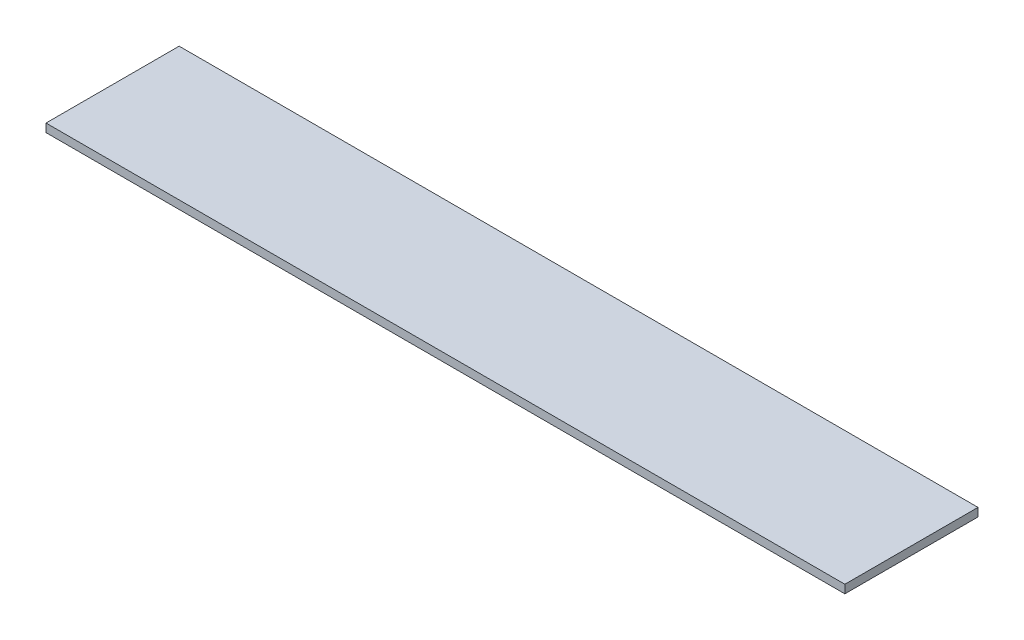
ISO-10303-21;
HEADER;
FILE_DESCRIPTION(('STEP AP214'),'2;1');
FILE_NAME('part.step','',(''),(''),'','','');
FILE_SCHEMA(('AUTOMOTIVE_DESIGN { 1 0 10303 214 1 1 1 1 }'));
ENDSEC;
DATA;
#1=APPLICATION_CONTEXT('core data for automotive mechanical design processes');
#2=APPLICATION_PROTOCOL_DEFINITION('international standard','automotive_design',2000,#1);
#3=PRODUCT_CONTEXT('',#1,'mechanical');
#4=PRODUCT('Part','Part','',(#3));
#5=PRODUCT_RELATED_PRODUCT_CATEGORY('part','',(#4));
#6=PRODUCT_DEFINITION_FORMATION('','',#4);
#7=PRODUCT_DEFINITION_CONTEXT('part definition',#1,'design');
#8=PRODUCT_DEFINITION('design','',#6,#7);
#9=PRODUCT_DEFINITION_SHAPE('','',#8);
#10=(LENGTH_UNIT() NAMED_UNIT(*) SI_UNIT(.MILLI.,.METRE.));
#11=(NAMED_UNIT(*) PLANE_ANGLE_UNIT() SI_UNIT($,.RADIAN.));
#12=(NAMED_UNIT(*) SI_UNIT($,.STERADIAN.) SOLID_ANGLE_UNIT());
#13=UNCERTAINTY_MEASURE_WITH_UNIT(LENGTH_MEASURE(1.E-05),#10,'distance_accuracy_value','');
#14=(GEOMETRIC_REPRESENTATION_CONTEXT(3) GLOBAL_UNCERTAINTY_ASSIGNED_CONTEXT((#13)) GLOBAL_UNIT_ASSIGNED_CONTEXT((#10,
#11,#12)) REPRESENTATION_CONTEXT('',''));
#15=CARTESIAN_POINT('',(0.,0.,0.));
#16=DIRECTION('',(0.,0.,1.));
#17=DIRECTION('',(1.,0.,0.));
#18=AXIS2_PLACEMENT_3D('',#15,#16,#17);
#19=CARTESIAN_POINT('',(-28.3111111111111,7.35555555555552,8.25));
#20=DIRECTION('',(1.,0.,0.));
#21=DIRECTION('',(0.,0.,1.));
#22=AXIS2_PLACEMENT_3D('',#19,#20,#21);
#23=PLANE('',#22);
#24=DIRECTION('',(0.,0.,-1.));
#25=VECTOR('',#24,1.);
#26=CARTESIAN_POINT('',(-28.3111111111111,8.35555555555552,8.25));
#27=LINE('',#26,#25);
#28=CARTESIAN_POINT('',(-28.3111111111111,8.35555555555552,8.25));
#29=VERTEX_POINT('',#28);
#30=CARTESIAN_POINT('',(-28.3111111111111,8.35555555555558,-7.75));
#31=VERTEX_POINT('',#30);
#32=EDGE_CURVE('E98',#29,#31,#27,.T.);
#33=ORIENTED_EDGE('',*,*,#32,.T.);
#34=DIRECTION('',(0.,1.,0.));
#35=VECTOR('',#34,1.);
#36=CARTESIAN_POINT('',(-28.3111111111111,7.35555555555558,-7.75));
#37=LINE('',#36,#35);
#38=CARTESIAN_POINT('',(-28.3111111111111,7.35555555555558,-7.75));
#39=VERTEX_POINT('',#38);
#40=EDGE_CURVE('E11',#39,#31,#37,.T.);
#41=ORIENTED_EDGE('',*,*,#40,.F.);
#42=DIRECTION('',(0.,0.,-1.));
#43=VECTOR('',#42,1.);
#44=CARTESIAN_POINT('',(-28.3111111111111,7.35555555555552,8.25));
#45=LINE('',#44,#43);
#46=CARTESIAN_POINT('',(-28.3111111111111,7.35555555555552,8.25));
#47=VERTEX_POINT('',#46);
#48=EDGE_CURVE('E86',#47,#39,#45,.T.);
#49=ORIENTED_EDGE('',*,*,#48,.F.);
#50=DIRECTION('',(0.,1.,0.));
#51=VECTOR('',#50,1.);
#52=CARTESIAN_POINT('',(-28.3111111111111,7.35555555555552,8.25));
#53=LINE('',#52,#51);
#54=EDGE_CURVE('E94',#47,#29,#53,.T.);
#55=ORIENTED_EDGE('',*,*,#54,.T.);
#56=EDGE_LOOP('',(#33,#41,#49,#55));
#57=FACE_BOUND('',#56,.T.);
#58=ADVANCED_FACE('F35',(#57),#23,.F.);
#59=CARTESIAN_POINT('',(-28.3111111111111,7.35555555555558,-7.75));
#60=DIRECTION('',(0.,0.,1.));
#61=DIRECTION('',(0.,-1.,0.));
#62=AXIS2_PLACEMENT_3D('',#59,#60,#61);
#63=PLANE('',#62);
#64=DIRECTION('',(1.,0.,0.));
#65=VECTOR('',#64,1.);
#66=CARTESIAN_POINT('',(-28.3111111111111,8.35555555555558,-7.75));
#67=LINE('',#66,#65);
#68=CARTESIAN_POINT('',(67.6888888888889,8.35555555555558,-7.75));
#69=VERTEX_POINT('',#68);
#70=EDGE_CURVE('E90',#31,#69,#67,.T.);
#71=ORIENTED_EDGE('',*,*,#70,.T.);
#72=DIRECTION('',(0.,1.,0.));
#73=VECTOR('',#72,1.);
#74=CARTESIAN_POINT('',(67.6888888888889,7.35555555555558,-7.75));
#75=LINE('',#74,#73);
#76=CARTESIAN_POINT('',(67.6888888888889,7.35555555555558,-7.75));
#77=VERTEX_POINT('',#76);
#78=EDGE_CURVE('E43',#77,#69,#75,.T.);
#79=ORIENTED_EDGE('',*,*,#78,.F.);
#80=DIRECTION('',(1.,0.,0.));
#81=VECTOR('',#80,1.);
#82=CARTESIAN_POINT('',(-28.3111111111111,7.35555555555558,-7.75));
#83=LINE('',#82,#81);
#84=EDGE_CURVE('E81',#39,#77,#83,.T.);
#85=ORIENTED_EDGE('',*,*,#84,.F.);
#86=ORIENTED_EDGE('',*,*,#40,.T.);
#87=EDGE_LOOP('',(#71,#79,#85,#86));
#88=FACE_BOUND('',#87,.T.);
#89=ADVANCED_FACE('F89',(#88),#63,.F.);
#90=CARTESIAN_POINT('',(67.6888888888889,7.35555555555552,8.25));
#91=DIRECTION('',(-1.,0.,0.));
#92=DIRECTION('',(0.,0.,-1.));
#93=AXIS2_PLACEMENT_3D('',#90,#91,#92);
#94=PLANE('',#93);
#95=DIRECTION('',(0.,0.,1.));
#96=VECTOR('',#95,1.);
#97=CARTESIAN_POINT('',(67.6888888888889,8.35555555555552,8.25));
#98=LINE('',#97,#96);
#99=CARTESIAN_POINT('',(67.6888888888889,8.35555555555552,8.25));
#100=VERTEX_POINT('',#99);
#101=EDGE_CURVE('E68',#69,#100,#98,.T.);
#102=ORIENTED_EDGE('',*,*,#101,.T.);
#103=DIRECTION('',(0.,1.,0.));
#104=VECTOR('',#103,1.);
#105=CARTESIAN_POINT('',(67.6888888888889,7.35555555555552,8.25));
#106=LINE('',#105,#104);
#107=CARTESIAN_POINT('',(67.6888888888889,7.35555555555552,8.25));
#108=VERTEX_POINT('',#107);
#109=EDGE_CURVE('E91',#108,#100,#106,.T.);
#110=ORIENTED_EDGE('',*,*,#109,.F.);
#111=DIRECTION('',(0.,0.,1.));
#112=VECTOR('',#111,1.);
#113=CARTESIAN_POINT('',(67.6888888888889,7.35555555555552,8.25));
#114=LINE('',#113,#112);
#115=EDGE_CURVE('E84',#77,#108,#114,.T.);
#116=ORIENTED_EDGE('',*,*,#115,.F.);
#117=ORIENTED_EDGE('',*,*,#78,.T.);
#118=EDGE_LOOP('',(#102,#110,#116,#117));
#119=FACE_BOUND('',#118,.T.);
#120=ADVANCED_FACE('F92',(#119),#94,.F.);
#121=CARTESIAN_POINT('',(-28.3111111111111,7.35555555555552,8.25));
#122=DIRECTION('',(0.,0.,-1.));
#123=DIRECTION('',(0.,1.,0.));
#124=AXIS2_PLACEMENT_3D('',#121,#122,#123);
#125=PLANE('',#124);
#126=DIRECTION('',(-1.,0.,0.));
#127=VECTOR('',#126,1.);
#128=CARTESIAN_POINT('',(-28.3111111111111,8.35555555555552,8.25));
#129=LINE('',#128,#127);
#130=EDGE_CURVE('E74',#100,#29,#129,.T.);
#131=ORIENTED_EDGE('',*,*,#130,.T.);
#132=ORIENTED_EDGE('',*,*,#54,.F.);
#133=DIRECTION('',(-1.,0.,0.));
#134=VECTOR('',#133,1.);
#135=CARTESIAN_POINT('',(-28.3111111111111,7.35555555555552,8.25));
#136=LINE('',#135,#134);
#137=EDGE_CURVE('E51',#108,#47,#136,.T.);
#138=ORIENTED_EDGE('',*,*,#137,.F.);
#139=ORIENTED_EDGE('',*,*,#109,.T.);
#140=EDGE_LOOP('',(#131,#132,#138,#139));
#141=FACE_BOUND('',#140,.T.);
#142=ADVANCED_FACE('F105',(#141),#125,.F.);
#143=CARTESIAN_POINT('',(0.,7.35555555555558,-7.85555555555555));
#144=DIRECTION('',(0.,-1.,0.));
#145=DIRECTION('',(1.,0.,0.));
#146=AXIS2_PLACEMENT_3D('',#143,#144,#145);
#147=PLANE('',#146);
#148=ORIENTED_EDGE('',*,*,#48,.T.);
#149=ORIENTED_EDGE('',*,*,#84,.T.);
#150=ORIENTED_EDGE('',*,*,#115,.T.);
#151=ORIENTED_EDGE('',*,*,#137,.T.);
#152=EDGE_LOOP('',(#148,#149,#150,#151));
#153=FACE_BOUND('',#152,.T.);
#154=ADVANCED_FACE('F82',(#153),#147,.T.);
#155=CARTESIAN_POINT('',(0.,8.35555555555558,-7.85555555555555));
#156=DIRECTION('',(0.,-1.,0.));
#157=DIRECTION('',(1.,0.,0.));
#158=AXIS2_PLACEMENT_3D('',#155,#156,#157);
#159=PLANE('',#158);
#160=ORIENTED_EDGE('',*,*,#32,.F.);
#161=ORIENTED_EDGE('',*,*,#130,.F.);
#162=ORIENTED_EDGE('',*,*,#101,.F.);
#163=ORIENTED_EDGE('',*,*,#70,.F.);
#164=EDGE_LOOP('',(#160,#161,#162,#163));
#165=FACE_BOUND('',#164,.T.);
#166=ADVANCED_FACE('F108',(#165),#159,.F.);
#167=CLOSED_SHELL('',(#58,#89,#120,#142,#154,#166));
#168=MANIFOLD_SOLID_BREP('B2',#167);
#169=ADVANCED_BREP_SHAPE_REPRESENTATION('',(#18,#168),#14);
#170=SHAPE_DEFINITION_REPRESENTATION(#9,#169);
ENDSEC;
END-ISO-10303-21;
